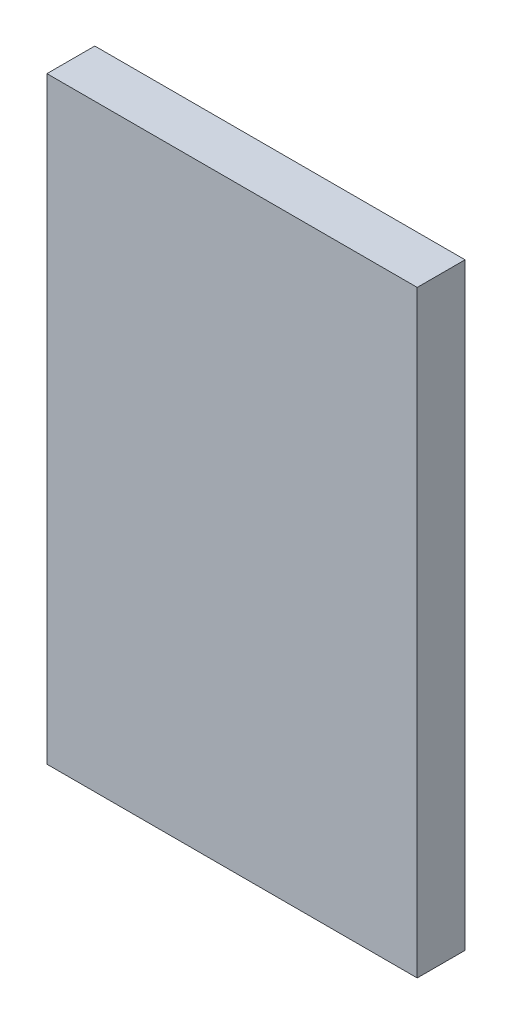
ISO-10303-21;
HEADER;
FILE_DESCRIPTION(('STEP AP214'),'2;1');
FILE_NAME('part.step','',(''),(''),'','','');
FILE_SCHEMA(('AUTOMOTIVE_DESIGN { 1 0 10303 214 1 1 1 1 }'));
ENDSEC;
DATA;
#1=APPLICATION_CONTEXT('core data for automotive mechanical design processes');
#2=APPLICATION_PROTOCOL_DEFINITION('international standard','automotive_design',2000,#1);
#3=PRODUCT_CONTEXT('',#1,'mechanical');
#4=PRODUCT('Part','Part','',(#3));
#5=PRODUCT_RELATED_PRODUCT_CATEGORY('part','',(#4));
#6=PRODUCT_DEFINITION_FORMATION('','',#4);
#7=PRODUCT_DEFINITION_CONTEXT('part definition',#1,'design');
#8=PRODUCT_DEFINITION('design','',#6,#7);
#9=PRODUCT_DEFINITION_SHAPE('','',#8);
#10=(LENGTH_UNIT() NAMED_UNIT(*) SI_UNIT(.MILLI.,.METRE.));
#11=(NAMED_UNIT(*) PLANE_ANGLE_UNIT() SI_UNIT($,.RADIAN.));
#12=(NAMED_UNIT(*) SI_UNIT($,.STERADIAN.) SOLID_ANGLE_UNIT());
#13=UNCERTAINTY_MEASURE_WITH_UNIT(LENGTH_MEASURE(1.E-05),#10,'distance_accuracy_value','');
#14=(GEOMETRIC_REPRESENTATION_CONTEXT(3) GLOBAL_UNCERTAINTY_ASSIGNED_CONTEXT((#13)) GLOBAL_UNIT_ASSIGNED_CONTEXT((#10,
#11,#12)) REPRESENTATION_CONTEXT('',''));
#15=CARTESIAN_POINT('',(0.,0.,0.));
#16=DIRECTION('',(0.,0.,1.));
#17=DIRECTION('',(1.,0.,0.));
#18=AXIS2_PLACEMENT_3D('',#15,#16,#17);
#19=CARTESIAN_POINT('',(-5.67802782663136,28.45,2.));
#20=DIRECTION('',(1.,0.,0.));
#21=DIRECTION('',(0.,0.,-1.));
#22=AXIS2_PLACEMENT_3D('',#19,#20,#21);
#23=PLANE('',#22);
#24=DIRECTION('',(0.,-1.,0.));
#25=VECTOR('',#24,1.);
#26=CARTESIAN_POINT('',(-5.67802782663136,28.45,0.));
#27=LINE('',#26,#25);
#28=CARTESIAN_POINT('',(-5.67802782663136,28.45,0.));
#29=VERTEX_POINT('',#28);
#30=CARTESIAN_POINT('',(-5.67802782663136,3.45,0.));
#31=VERTEX_POINT('',#30);
#32=EDGE_CURVE('E100',#29,#31,#27,.T.);
#33=ORIENTED_EDGE('',*,*,#32,.T.);
#34=DIRECTION('',(0.,0.,-1.));
#35=VECTOR('',#34,1.);
#36=CARTESIAN_POINT('',(-5.67802782663136,3.45,2.));
#37=LINE('',#36,#35);
#38=CARTESIAN_POINT('',(-5.67802782663136,3.45,2.));
#39=VERTEX_POINT('',#38);
#40=EDGE_CURVE('E11',#39,#31,#37,.T.);
#41=ORIENTED_EDGE('',*,*,#40,.F.);
#42=DIRECTION('',(0.,-1.,0.));
#43=VECTOR('',#42,1.);
#44=CARTESIAN_POINT('',(-5.67802782663136,28.45,2.));
#45=LINE('',#44,#43);
#46=CARTESIAN_POINT('',(-5.67802782663136,28.45,2.));
#47=VERTEX_POINT('',#46);
#48=EDGE_CURVE('E88',#47,#39,#45,.T.);
#49=ORIENTED_EDGE('',*,*,#48,.F.);
#50=DIRECTION('',(0.,0.,-1.));
#51=VECTOR('',#50,1.);
#52=CARTESIAN_POINT('',(-5.67802782663136,28.45,2.));
#53=LINE('',#52,#51);
#54=EDGE_CURVE('E96',#47,#29,#53,.T.);
#55=ORIENTED_EDGE('',*,*,#54,.T.);
#56=EDGE_LOOP('',(#33,#41,#49,#55));
#57=FACE_BOUND('',#56,.T.);
#58=ADVANCED_FACE('F37',(#57),#23,.F.);
#59=CARTESIAN_POINT('',(-5.67802782663136,3.45,2.));
#60=DIRECTION('',(0.,1.,0.));
#61=DIRECTION('',(0.,0.,1.));
#62=AXIS2_PLACEMENT_3D('',#59,#60,#61);
#63=PLANE('',#62);
#64=DIRECTION('',(1.,0.,0.));
#65=VECTOR('',#64,1.);
#66=CARTESIAN_POINT('',(-5.67802782663136,3.45,0.));
#67=LINE('',#66,#65);
#68=CARTESIAN_POINT('',(9.8,3.45,0.));
#69=VERTEX_POINT('',#68);
#70=EDGE_CURVE('E92',#31,#69,#67,.T.);
#71=ORIENTED_EDGE('',*,*,#70,.T.);
#72=DIRECTION('',(0.,0.,-1.));
#73=VECTOR('',#72,1.);
#74=CARTESIAN_POINT('',(9.8,3.45,2.));
#75=LINE('',#74,#73);
#76=CARTESIAN_POINT('',(9.8,3.45,2.));
#77=VERTEX_POINT('',#76);
#78=EDGE_CURVE('E45',#77,#69,#75,.T.);
#79=ORIENTED_EDGE('',*,*,#78,.F.);
#80=DIRECTION('',(1.,0.,0.));
#81=VECTOR('',#80,1.);
#82=CARTESIAN_POINT('',(-5.67802782663136,3.45,2.));
#83=LINE('',#82,#81);
#84=EDGE_CURVE('E83',#39,#77,#83,.T.);
#85=ORIENTED_EDGE('',*,*,#84,.F.);
#86=ORIENTED_EDGE('',*,*,#40,.T.);
#87=EDGE_LOOP('',(#71,#79,#85,#86));
#88=FACE_BOUND('',#87,.T.);
#89=ADVANCED_FACE('F91',(#88),#63,.F.);
#90=CARTESIAN_POINT('',(9.8,3.45,2.));
#91=DIRECTION('',(-1.,0.,0.));
#92=DIRECTION('',(0.,0.,1.));
#93=AXIS2_PLACEMENT_3D('',#90,#91,#92);
#94=PLANE('',#93);
#95=DIRECTION('',(0.,1.,0.));
#96=VECTOR('',#95,1.);
#97=CARTESIAN_POINT('',(9.8,3.45,0.));
#98=LINE('',#97,#96);
#99=CARTESIAN_POINT('',(9.8,28.45,0.));
#100=VERTEX_POINT('',#99);
#101=EDGE_CURVE('E70',#69,#100,#98,.T.);
#102=ORIENTED_EDGE('',*,*,#101,.T.);
#103=DIRECTION('',(0.,0.,-1.));
#104=VECTOR('',#103,1.);
#105=CARTESIAN_POINT('',(9.8,28.45,2.));
#106=LINE('',#105,#104);
#107=CARTESIAN_POINT('',(9.8,28.45,2.));
#108=VERTEX_POINT('',#107);
#109=EDGE_CURVE('E93',#108,#100,#106,.T.);
#110=ORIENTED_EDGE('',*,*,#109,.F.);
#111=DIRECTION('',(0.,1.,0.));
#112=VECTOR('',#111,1.);
#113=CARTESIAN_POINT('',(9.8,3.45,2.));
#114=LINE('',#113,#112);
#115=EDGE_CURVE('E86',#77,#108,#114,.T.);
#116=ORIENTED_EDGE('',*,*,#115,.F.);
#117=ORIENTED_EDGE('',*,*,#78,.T.);
#118=EDGE_LOOP('',(#102,#110,#116,#117));
#119=FACE_BOUND('',#118,.T.);
#120=ADVANCED_FACE('F94',(#119),#94,.F.);
#121=CARTESIAN_POINT('',(9.8,28.45,2.));
#122=DIRECTION('',(0.,-1.,0.));
#123=DIRECTION('',(0.,0.,-1.));
#124=AXIS2_PLACEMENT_3D('',#121,#122,#123);
#125=PLANE('',#124);
#126=DIRECTION('',(-1.,0.,0.));
#127=VECTOR('',#126,1.);
#128=CARTESIAN_POINT('',(9.8,28.45,0.));
#129=LINE('',#128,#127);
#130=EDGE_CURVE('E76',#100,#29,#129,.T.);
#131=ORIENTED_EDGE('',*,*,#130,.T.);
#132=ORIENTED_EDGE('',*,*,#54,.F.);
#133=DIRECTION('',(-1.,0.,0.));
#134=VECTOR('',#133,1.);
#135=CARTESIAN_POINT('',(9.8,28.45,2.));
#136=LINE('',#135,#134);
#137=EDGE_CURVE('E53',#108,#47,#136,.T.);
#138=ORIENTED_EDGE('',*,*,#137,.F.);
#139=ORIENTED_EDGE('',*,*,#109,.T.);
#140=EDGE_LOOP('',(#131,#132,#138,#139));
#141=FACE_BOUND('',#140,.T.);
#142=ADVANCED_FACE('F107',(#141),#125,.F.);
#143=CARTESIAN_POINT('',(0.,0.,2.));
#144=DIRECTION('',(0.,0.,1.));
#145=DIRECTION('',(1.,0.,0.));
#146=AXIS2_PLACEMENT_3D('',#143,#144,#145);
#147=PLANE('',#146);
#148=ORIENTED_EDGE('',*,*,#48,.T.);
#149=ORIENTED_EDGE('',*,*,#84,.T.);
#150=ORIENTED_EDGE('',*,*,#115,.T.);
#151=ORIENTED_EDGE('',*,*,#137,.T.);
#152=EDGE_LOOP('',(#148,#149,#150,#151));
#153=FACE_BOUND('',#152,.T.);
#154=ADVANCED_FACE('F84',(#153),#147,.T.);
#155=CARTESIAN_POINT('',(0.,0.,0.));
#156=DIRECTION('',(0.,0.,1.));
#157=DIRECTION('',(1.,0.,0.));
#158=AXIS2_PLACEMENT_3D('',#155,#156,#157);
#159=PLANE('',#158);
#160=ORIENTED_EDGE('',*,*,#32,.F.);
#161=ORIENTED_EDGE('',*,*,#130,.F.);
#162=ORIENTED_EDGE('',*,*,#101,.F.);
#163=ORIENTED_EDGE('',*,*,#70,.F.);
#164=EDGE_LOOP('',(#160,#161,#162,#163));
#165=FACE_BOUND('',#164,.T.);
#166=ADVANCED_FACE('F110',(#165),#159,.F.);
#167=CLOSED_SHELL('',(#58,#89,#120,#142,#154,#166));
#168=MANIFOLD_SOLID_BREP('B2',#167);
#169=ADVANCED_BREP_SHAPE_REPRESENTATION('',(#18,#168),#14);
#170=SHAPE_DEFINITION_REPRESENTATION(#9,#169);
ENDSEC;
END-ISO-10303-21;
